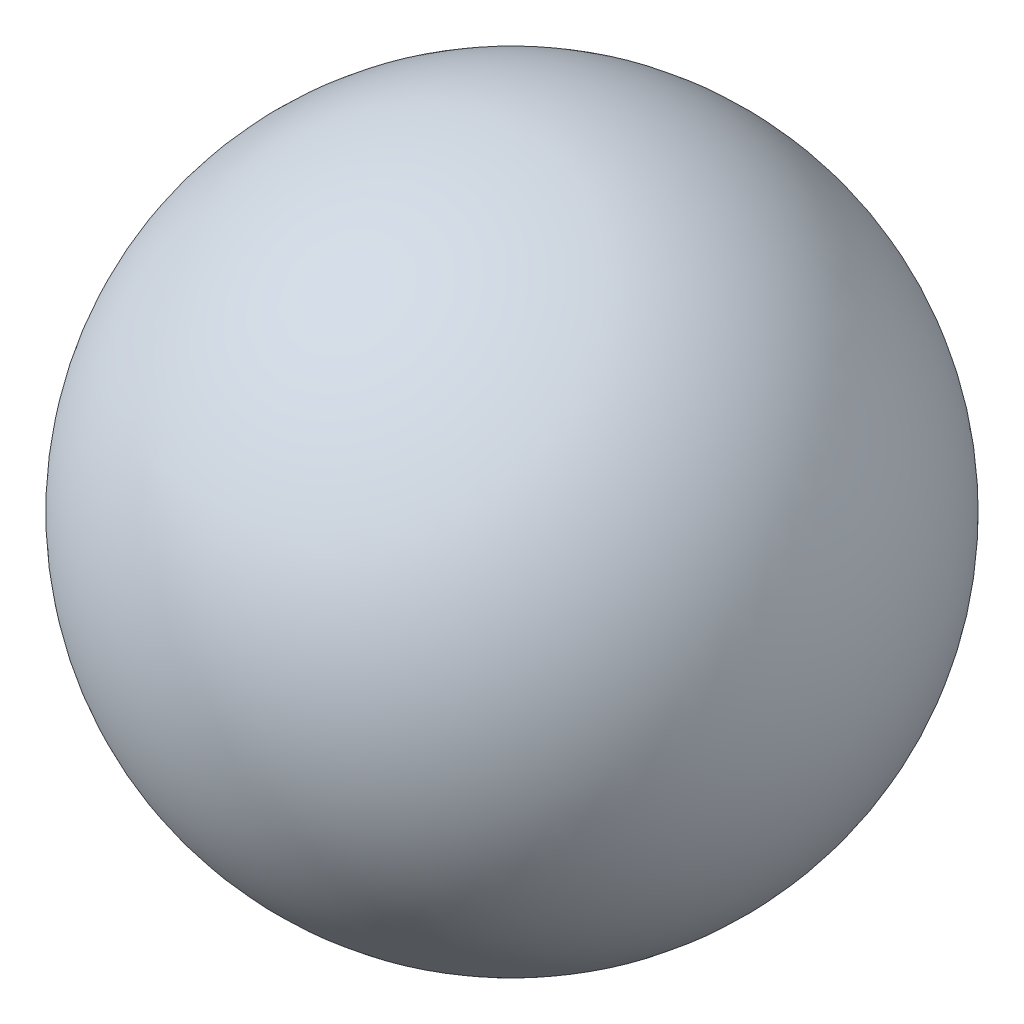
ISO-10303-21;
HEADER;
FILE_DESCRIPTION(('STEP AP214'),'2;1');
FILE_NAME('part.step','',(''),(''),'','','');
FILE_SCHEMA(('AUTOMOTIVE_DESIGN { 1 0 10303 214 1 1 1 1 }'));
ENDSEC;
DATA;
#1=APPLICATION_CONTEXT('core data for automotive mechanical design processes');
#2=APPLICATION_PROTOCOL_DEFINITION('international standard','automotive_design',2000,#1);
#3=PRODUCT_CONTEXT('',#1,'mechanical');
#4=PRODUCT('Part','Part','',(#3));
#5=PRODUCT_RELATED_PRODUCT_CATEGORY('part','',(#4));
#6=PRODUCT_DEFINITION_FORMATION('','',#4);
#7=PRODUCT_DEFINITION_CONTEXT('part definition',#1,'design');
#8=PRODUCT_DEFINITION('design','',#6,#7);
#9=PRODUCT_DEFINITION_SHAPE('','',#8);
#10=(LENGTH_UNIT() NAMED_UNIT(*) SI_UNIT(.MILLI.,.METRE.));
#11=(NAMED_UNIT(*) PLANE_ANGLE_UNIT() SI_UNIT($,.RADIAN.));
#12=(NAMED_UNIT(*) SI_UNIT($,.STERADIAN.) SOLID_ANGLE_UNIT());
#13=UNCERTAINTY_MEASURE_WITH_UNIT(LENGTH_MEASURE(1.E-05),#10,'distance_accuracy_value','');
#14=(GEOMETRIC_REPRESENTATION_CONTEXT(3) GLOBAL_UNCERTAINTY_ASSIGNED_CONTEXT((#13)) GLOBAL_UNIT_ASSIGNED_CONTEXT((#10,
#11,#12)) REPRESENTATION_CONTEXT('',''));
#15=CARTESIAN_POINT('',(0.,0.,0.));
#16=DIRECTION('',(0.,0.,1.));
#17=DIRECTION('',(1.,0.,0.));
#18=AXIS2_PLACEMENT_3D('',#15,#16,#17);
#19=CARTESIAN_POINT('',(0.,0.,0.));
#20=DIRECTION('',(0.,-1.,0.));
#21=DIRECTION('',(-1.,0.,0.));
#22=AXIS2_PLACEMENT_3D('',#19,#20,#21);
#23=SPHERICAL_SURFACE('',#22,786.18);
#24=CARTESIAN_POINT('',(0.,-786.18,0.));
#25=VERTEX_POINT('',#24);
#26=VERTEX_LOOP('',#25);
#27=FACE_BOUND('',#26,.T.);
#28=ADVANCED_FACE('F34',(#27),#23,.T.);
#29=CLOSED_SHELL('',(#28));
#30=CARTESIAN_POINT('',(0.,0.,0.));
#31=DIRECTION('',(0.,-1.,0.));
#32=DIRECTION('',(1.,0.,0.));
#33=AXIS2_PLACEMENT_3D('',#30,#31,#32);
#34=SPHERICAL_SURFACE('',#33,785.);
#35=CARTESIAN_POINT('',(0.,-785.,0.));
#36=VERTEX_POINT('',#35);
#37=VERTEX_LOOP('',#36);
#38=FACE_BOUND('',#37,.T.);
#39=ADVANCED_FACE('F36',(#38),#34,.F.);
#40=CLOSED_SHELL('',(#39));
#41=ORIENTED_CLOSED_SHELL('',*,#40,.T.);
#42=BREP_WITH_VOIDS('B2',#29,(#41));
#43=ADVANCED_BREP_SHAPE_REPRESENTATION('',(#18,#42),#14);
#44=SHAPE_DEFINITION_REPRESENTATION(#9,#43);
ENDSEC;
END-ISO-10303-21;
